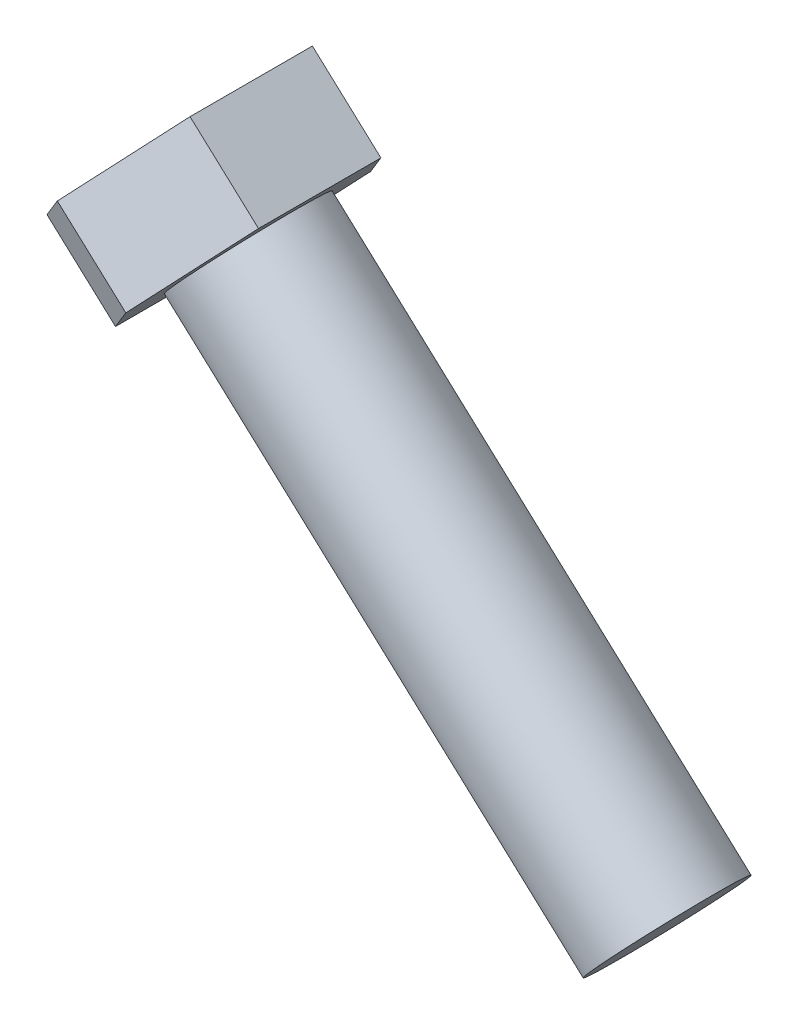
ISO-10303-21;
HEADER;
FILE_DESCRIPTION(('STEP AP214'),'2;1');
FILE_NAME('part.step','',(''),(''),'','','');
FILE_SCHEMA(('AUTOMOTIVE_DESIGN { 1 0 10303 214 1 1 1 1 }'));
ENDSEC;
DATA;
#1=APPLICATION_CONTEXT('core data for automotive mechanical design processes');
#2=APPLICATION_PROTOCOL_DEFINITION('international standard','automotive_design',2000,#1);
#3=PRODUCT_CONTEXT('',#1,'mechanical');
#4=PRODUCT('Part','Part','',(#3));
#5=PRODUCT_RELATED_PRODUCT_CATEGORY('part','',(#4));
#6=PRODUCT_DEFINITION_FORMATION('','',#4);
#7=PRODUCT_DEFINITION_CONTEXT('part definition',#1,'design');
#8=PRODUCT_DEFINITION('design','',#6,#7);
#9=PRODUCT_DEFINITION_SHAPE('','',#8);
#10=(LENGTH_UNIT() NAMED_UNIT(*) SI_UNIT(.MILLI.,.METRE.));
#11=(NAMED_UNIT(*) PLANE_ANGLE_UNIT() SI_UNIT($,.RADIAN.));
#12=(NAMED_UNIT(*) SI_UNIT($,.STERADIAN.) SOLID_ANGLE_UNIT());
#13=UNCERTAINTY_MEASURE_WITH_UNIT(LENGTH_MEASURE(1.E-05),#10,'distance_accuracy_value','');
#14=(GEOMETRIC_REPRESENTATION_CONTEXT(3) GLOBAL_UNCERTAINTY_ASSIGNED_CONTEXT((#13)) GLOBAL_UNIT_ASSIGNED_CONTEXT((#10,
#11,#12)) REPRESENTATION_CONTEXT('',''));
#15=CARTESIAN_POINT('',(0.,0.,0.));
#16=DIRECTION('',(0.,0.,1.));
#17=DIRECTION('',(1.,0.,0.));
#18=AXIS2_PLACEMENT_3D('',#15,#16,#17);
#19=CARTESIAN_POINT('',(19.7401172323591,65.5117349268509,0.));
#20=DIRECTION('',(-0.737900796388129,0.674909189958001,0.));
#21=DIRECTION('',(0.,0.,1.));
#22=AXIS2_PLACEMENT_3D('',#19,#20,#21);
#23=PLANE('',#22);
#24=DIRECTION('',(-0.584488503751206,-0.639040835144888,-0.5));
#25=VECTOR('',#24,1.);
#26=CARTESIAN_POINT('',(22.0516812079652,68.0390451544802,14.0677259840766));
#27=LINE('',#26,#25);
#28=CARTESIAN_POINT('',(24.3632451835714,70.5663553821095,16.045150656051));
#29=VERTEX_POINT('',#28);
#30=CARTESIAN_POINT('',(19.7401172323591,65.5117349268509,12.0903013121021));
#31=VERTEX_POINT('',#30);
#32=EDGE_CURVE('E114',#29,#31,#27,.T.);
#33=ORIENTED_EDGE('',*,*,#32,.T.);
#34=DIRECTION('',(-0.584488503751206,-0.639040835144889,0.5));
#35=VECTOR('',#34,1.);
#36=CARTESIAN_POINT('',(17.4285532567529,62.9844246992215,14.0677259840766));
#37=LINE('',#36,#35);
#38=CARTESIAN_POINT('',(15.1169892811467,60.4571144715922,16.045150656051));
#39=VERTEX_POINT('',#38);
#40=EDGE_CURVE('E95',#31,#39,#37,.T.);
#41=ORIENTED_EDGE('',*,*,#40,.T.);
#42=DIRECTION('',(0.,0.,1.));
#43=VECTOR('',#42,1.);
#44=CARTESIAN_POINT('',(15.1169892811467,60.4571144715922,20.));
#45=LINE('',#44,#43);
#46=CARTESIAN_POINT('',(15.1169892811467,60.4571144715922,23.9548493439489));
#47=VERTEX_POINT('',#46);
#48=EDGE_CURVE('E121',#39,#47,#45,.T.);
#49=ORIENTED_EDGE('',*,*,#48,.T.);
#50=DIRECTION('',(0.584488503751206,0.639040835144888,0.5));
#51=VECTOR('',#50,1.);
#52=CARTESIAN_POINT('',(17.4285532567529,62.9844246992215,25.9322740159234));
#53=LINE('',#52,#51);
#54=CARTESIAN_POINT('',(19.7401172323591,65.5117349268509,27.9096986878978));
#55=VERTEX_POINT('',#54);
#56=EDGE_CURVE('E133',#47,#55,#53,.T.);
#57=ORIENTED_EDGE('',*,*,#56,.T.);
#58=DIRECTION('',(0.584488503751206,0.639040835144888,-0.5));
#59=VECTOR('',#58,1.);
#60=CARTESIAN_POINT('',(22.0516812079652,68.0390451544802,25.9322740159234));
#61=LINE('',#60,#59);
#62=CARTESIAN_POINT('',(24.3632451835714,70.5663553821095,23.9548493439489));
#63=VERTEX_POINT('',#62);
#64=EDGE_CURVE('E142',#55,#63,#61,.T.);
#65=ORIENTED_EDGE('',*,*,#64,.T.);
#66=DIRECTION('',(0.,0.,-1.));
#67=VECTOR('',#66,1.);
#68=CARTESIAN_POINT('',(24.3632451835714,70.5663553821095,20.));
#69=LINE('',#68,#67);
#70=EDGE_CURVE('E25',#63,#29,#69,.T.);
#71=ORIENTED_EDGE('',*,*,#70,.T.);
#72=EDGE_LOOP('',(#33,#41,#49,#57,#65,#71));
#73=FACE_BOUND('',#72,.T.);
#74=ADVANCED_FACE('F16',(#73),#23,.T.);
#75=CARTESIAN_POINT('',(24.1675220106879,61.4622797871028,0.));
#76=DIRECTION('',(-0.737900796388129,0.674909189958001,0.));
#77=DIRECTION('',(0.,0.,1.));
#78=AXIS2_PLACEMENT_3D('',#75,#76,#77);
#79=PLANE('',#78);
#80=CARTESIAN_POINT('',(24.1675220106879,61.4622797871028,20.));
#81=DIRECTION('',(-0.737900796388129,0.674909189958001,0.));
#82=DIRECTION('',(-0.674909189958001,-0.737900796388129,0.));
#83=AXIS2_PLACEMENT_3D('',#80,#81,#82);
#84=CIRCLE('',#83,4.5);
#85=CARTESIAN_POINT('',(21.1304306558769,58.1417262033562,20.));
#86=VERTEX_POINT('',#85);
#87=EDGE_CURVE('E158',#86,#86,#84,.T.);
#88=ORIENTED_EDGE('',*,*,#87,.T.);
#89=EDGE_LOOP('',(#88));
#90=FACE_BOUND('',#89,.T.);
#91=DIRECTION('',(-0.584488503751206,-0.639040835144888,-0.5));
#92=VECTOR('',#91,1.);
#93=CARTESIAN_POINT('',(26.479085986294,63.9895900147322,14.0677259840766));
#94=LINE('',#93,#92);
#95=CARTESIAN_POINT('',(28.7906499619002,66.5169002423615,16.045150656051));
#96=VERTEX_POINT('',#95);
#97=CARTESIAN_POINT('',(24.1675220106879,61.4622797871028,12.0903013121021));
#98=VERTEX_POINT('',#97);
#99=EDGE_CURVE('E86',#96,#98,#94,.T.);
#100=ORIENTED_EDGE('',*,*,#99,.F.);
#101=DIRECTION('',(0.,0.,-1.));
#102=VECTOR('',#101,1.);
#103=CARTESIAN_POINT('',(28.7906499619002,66.5169002423615,20.));
#104=LINE('',#103,#102);
#105=CARTESIAN_POINT('',(28.7906499619002,66.5169002423615,23.9548493439489));
#106=VERTEX_POINT('',#105);
#107=EDGE_CURVE('E11',#106,#96,#104,.T.);
#108=ORIENTED_EDGE('',*,*,#107,.F.);
#109=DIRECTION('',(0.584488503751206,0.639040835144888,-0.5));
#110=VECTOR('',#109,1.);
#111=CARTESIAN_POINT('',(26.479085986294,63.9895900147322,25.9322740159234));
#112=LINE('',#111,#110);
#113=CARTESIAN_POINT('',(24.1675220106879,61.4622797871028,27.9096986878978));
#114=VERTEX_POINT('',#113);
#115=EDGE_CURVE('E146',#114,#106,#112,.T.);
#116=ORIENTED_EDGE('',*,*,#115,.F.);
#117=DIRECTION('',(0.584488503751206,0.639040835144888,0.5));
#118=VECTOR('',#117,1.);
#119=CARTESIAN_POINT('',(21.8559580350817,58.9349695594735,25.9322740159234));
#120=LINE('',#119,#118);
#121=CARTESIAN_POINT('',(19.5443940594755,56.4076593318442,23.9548493439489));
#122=VERTEX_POINT('',#121);
#123=EDGE_CURVE('E137',#122,#114,#120,.T.);
#124=ORIENTED_EDGE('',*,*,#123,.F.);
#125=DIRECTION('',(0.,0.,1.));
#126=VECTOR('',#125,1.);
#127=CARTESIAN_POINT('',(19.5443940594755,56.4076593318441,20.));
#128=LINE('',#127,#126);
#129=CARTESIAN_POINT('',(19.5443940594755,56.4076593318442,16.045150656051));
#130=VERTEX_POINT('',#129);
#131=EDGE_CURVE('E89',#130,#122,#128,.T.);
#132=ORIENTED_EDGE('',*,*,#131,.F.);
#133=DIRECTION('',(-0.584488503751206,-0.639040835144889,0.5));
#134=VECTOR('',#133,1.);
#135=CARTESIAN_POINT('',(21.8559580350817,58.9349695594735,14.0677259840766));
#136=LINE('',#135,#134);
#137=EDGE_CURVE('E83',#98,#130,#136,.T.);
#138=ORIENTED_EDGE('',*,*,#137,.F.);
#139=EDGE_LOOP('',(#100,#108,#116,#124,#132,#138));
#140=FACE_BOUND('',#139,.T.);
#141=ADVANCED_FACE('F18',(#90,#140),#79,.F.);
#142=CARTESIAN_POINT('',(28.7906499619002,66.5169002423615,20.));
#143=DIRECTION('',(0.674909189958001,0.737900796388129,0.));
#144=DIRECTION('',(0.,0.,-1.));
#145=AXIS2_PLACEMENT_3D('',#142,#143,#144);
#146=PLANE('',#145);
#147=ORIENTED_EDGE('',*,*,#70,.F.);
#148=DIRECTION('',(-0.737900796388129,0.674909189958001,0.));
#149=VECTOR('',#148,1.);
#150=CARTESIAN_POINT('',(28.7906499619002,66.5169002423615,23.9548493439489));
#151=LINE('',#150,#149);
#152=EDGE_CURVE('E150',#106,#63,#151,.T.);
#153=ORIENTED_EDGE('',*,*,#152,.F.);
#154=ORIENTED_EDGE('',*,*,#107,.T.);
#155=DIRECTION('',(-0.737900796388129,0.674909189958001,0.));
#156=VECTOR('',#155,1.);
#157=CARTESIAN_POINT('',(28.7906499619002,66.5169002423615,16.045150656051));
#158=LINE('',#157,#156);
#159=EDGE_CURVE('E107',#96,#29,#158,.T.);
#160=ORIENTED_EDGE('',*,*,#159,.T.);
#161=EDGE_LOOP('',(#147,#153,#154,#160));
#162=FACE_BOUND('',#161,.T.);
#163=ADVANCED_FACE('F156',(#162),#146,.T.);
#164=CARTESIAN_POINT('',(26.479085986294,63.9895900147322,25.9322740159234));
#165=DIRECTION('',(0.337454594979001,0.368950398194065,0.866025403784438));
#166=DIRECTION('',(0.737900796388129,-0.674909189958001,0.));
#167=AXIS2_PLACEMENT_3D('',#164,#165,#166);
#168=PLANE('',#167);
#169=ORIENTED_EDGE('',*,*,#64,.F.);
#170=DIRECTION('',(-0.737900796388129,0.674909189958001,0.));
#171=VECTOR('',#170,1.);
#172=CARTESIAN_POINT('',(24.1675220106879,61.4622797871028,27.9096986878978));
#173=LINE('',#172,#171);
#174=EDGE_CURVE('E141',#114,#55,#173,.T.);
#175=ORIENTED_EDGE('',*,*,#174,.F.);
#176=ORIENTED_EDGE('',*,*,#115,.T.);
#177=ORIENTED_EDGE('',*,*,#152,.T.);
#178=EDGE_LOOP('',(#169,#175,#176,#177));
#179=FACE_BOUND('',#178,.T.);
#180=ADVANCED_FACE('F191',(#179),#168,.T.);
#181=CARTESIAN_POINT('',(21.8559580350817,58.9349695594735,25.9322740159234));
#182=DIRECTION('',(-0.337454594978999,-0.368950398194064,0.86602540378444));
#183=DIRECTION('',(-0.73790079638813,0.674909189958,0.));
#184=AXIS2_PLACEMENT_3D('',#181,#182,#183);
#185=PLANE('',#184);
#186=ORIENTED_EDGE('',*,*,#56,.F.);
#187=DIRECTION('',(-0.737900796388129,0.674909189958001,0.));
#188=VECTOR('',#187,1.);
#189=CARTESIAN_POINT('',(19.5443940594755,56.4076593318442,23.9548493439489));
#190=LINE('',#189,#188);
#191=EDGE_CURVE('E129',#122,#47,#190,.T.);
#192=ORIENTED_EDGE('',*,*,#191,.F.);
#193=ORIENTED_EDGE('',*,*,#123,.T.);
#194=ORIENTED_EDGE('',*,*,#174,.T.);
#195=EDGE_LOOP('',(#186,#192,#193,#194));
#196=FACE_BOUND('',#195,.T.);
#197=ADVANCED_FACE('F178',(#196),#185,.T.);
#198=CARTESIAN_POINT('',(19.5443940594755,56.4076593318441,20.));
#199=DIRECTION('',(-0.674909189958001,-0.737900796388129,0.));
#200=DIRECTION('',(-0.737900796388129,0.674909189958001,0.));
#201=AXIS2_PLACEMENT_3D('',#198,#199,#200);
#202=PLANE('',#201);
#203=ORIENTED_EDGE('',*,*,#48,.F.);
#204=DIRECTION('',(-0.737900796388129,0.674909189958001,0.));
#205=VECTOR('',#204,1.);
#206=CARTESIAN_POINT('',(19.5443940594755,56.4076593318442,16.045150656051));
#207=LINE('',#206,#205);
#208=EDGE_CURVE('E94',#130,#39,#207,.T.);
#209=ORIENTED_EDGE('',*,*,#208,.F.);
#210=ORIENTED_EDGE('',*,*,#131,.T.);
#211=ORIENTED_EDGE('',*,*,#191,.T.);
#212=EDGE_LOOP('',(#203,#209,#210,#211));
#213=FACE_BOUND('',#212,.T.);
#214=ADVANCED_FACE('F182',(#213),#202,.T.);
#215=CARTESIAN_POINT('',(21.8559580350817,58.9349695594735,14.0677259840766));
#216=DIRECTION('',(-0.337454594979001,-0.368950398194065,-0.866025403784438));
#217=DIRECTION('',(0.,-0.919990377532624,0.391940946122473));
#218=AXIS2_PLACEMENT_3D('',#215,#216,#217);
#219=PLANE('',#218);
#220=ORIENTED_EDGE('',*,*,#40,.F.);
#221=DIRECTION('',(-0.737900796388129,0.674909189958001,0.));
#222=VECTOR('',#221,1.);
#223=CARTESIAN_POINT('',(24.1675220106879,61.4622797871028,12.0903013121021));
#224=LINE('',#223,#222);
#225=EDGE_CURVE('E98',#98,#31,#224,.T.);
#226=ORIENTED_EDGE('',*,*,#225,.F.);
#227=ORIENTED_EDGE('',*,*,#137,.T.);
#228=ORIENTED_EDGE('',*,*,#208,.T.);
#229=EDGE_LOOP('',(#220,#226,#227,#228));
#230=FACE_BOUND('',#229,.T.);
#231=ADVANCED_FACE('F99',(#230),#219,.T.);
#232=CARTESIAN_POINT('',(26.479085986294,63.9895900147322,14.0677259840766));
#233=DIRECTION('',(0.337454594979,0.368950398194064,-0.866025403784439));
#234=DIRECTION('',(-0.931762069300781,0.,-0.363069478491827));
#235=AXIS2_PLACEMENT_3D('',#232,#233,#234);
#236=PLANE('',#235);
#237=ORIENTED_EDGE('',*,*,#32,.F.);
#238=ORIENTED_EDGE('',*,*,#159,.F.);
#239=ORIENTED_EDGE('',*,*,#99,.T.);
#240=ORIENTED_EDGE('',*,*,#225,.T.);
#241=EDGE_LOOP('',(#237,#238,#239,#240));
#242=FACE_BOUND('',#241,.T.);
#243=ADVANCED_FACE('F106',(#242),#236,.T.);
#244=CARTESIAN_POINT('',(51.2484812381322,36.6931125156442,0.));
#245=DIRECTION('',(-0.737900796388129,0.674909189958001,0.));
#246=DIRECTION('',(0.,0.,1.));
#247=AXIS2_PLACEMENT_3D('',#244,#245,#246);
#248=PLANE('',#247);
#249=CARTESIAN_POINT('',(51.2484812381322,36.6931125156442,20.));
#250=DIRECTION('',(-0.737900796388129,0.674909189958001,0.));
#251=DIRECTION('',(-0.674909189958001,-0.737900796388129,0.));
#252=AXIS2_PLACEMENT_3D('',#249,#250,#251);
#253=CIRCLE('',#252,4.5);
#254=CARTESIAN_POINT('',(48.2113898833212,33.3725589318976,20.));
#255=VERTEX_POINT('',#254);
#256=EDGE_CURVE('E163',#255,#255,#253,.T.);
#257=ORIENTED_EDGE('',*,*,#256,.F.);
#258=EDGE_LOOP('',(#257));
#259=FACE_BOUND('',#258,.T.);
#260=ADVANCED_FACE('F238',(#259),#248,.F.);
#261=CARTESIAN_POINT('',(51.2484812381322,36.6931125156442,20.));
#262=DIRECTION('',(-0.737900796388129,0.674909189958001,0.));
#263=DIRECTION('',(-0.674909189958001,-0.737900796388129,0.));
#264=AXIS2_PLACEMENT_3D('',#261,#262,#263);
#265=CYLINDRICAL_SURFACE('',#264,4.5);
#266=ORIENTED_EDGE('',*,*,#87,.F.);
#267=EDGE_LOOP('',(#266));
#268=FACE_BOUND('',#267,.T.);
#269=ORIENTED_EDGE('',*,*,#256,.T.);
#270=EDGE_LOOP('',(#269));
#271=FACE_BOUND('',#270,.T.);
#272=ADVANCED_FACE('F248',(#268,#271),#265,.T.);
#273=CLOSED_SHELL('',(#74,#141,#163,#180,#197,#214,#231,#243,#260,#272));
#274=MANIFOLD_SOLID_BREP('B1',#273);
#275=ADVANCED_BREP_SHAPE_REPRESENTATION('',(#18,#274),#14);
#276=SHAPE_DEFINITION_REPRESENTATION(#9,#275);
ENDSEC;
END-ISO-10303-21;
